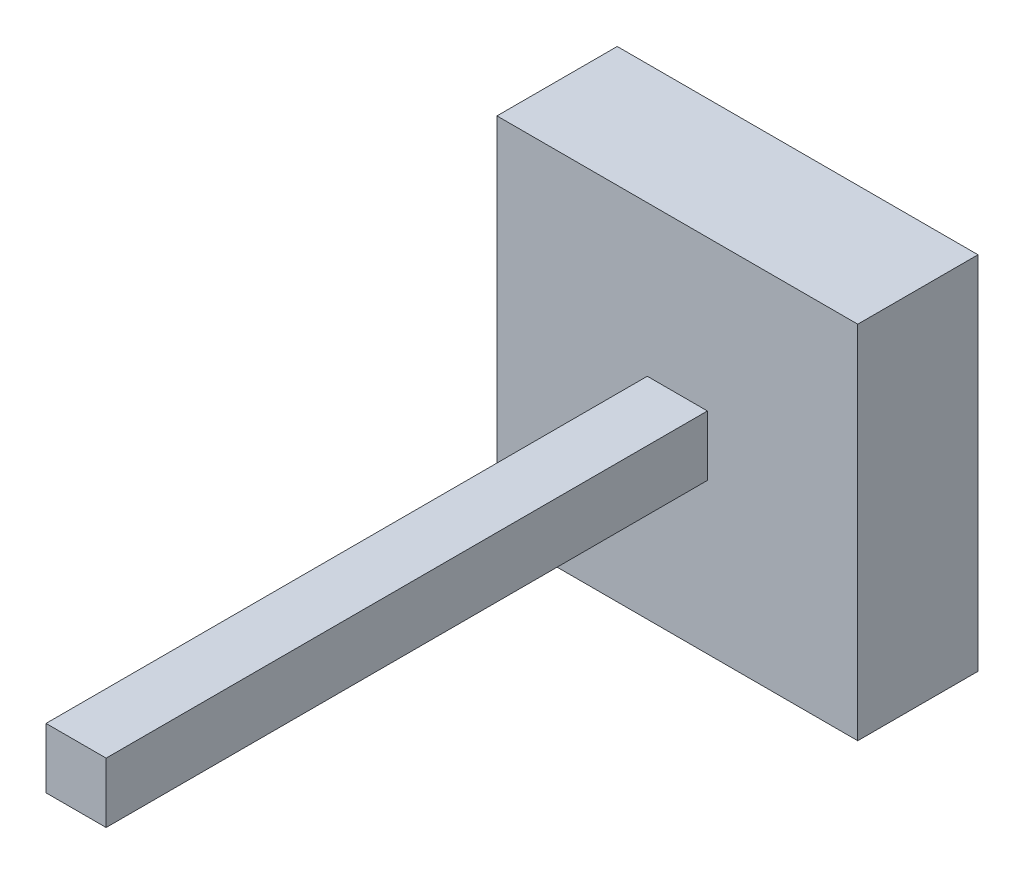
ISO-10303-21;
HEADER;
FILE_DESCRIPTION(('STEP AP214'),'2;1');
FILE_NAME('part.step','',(''),(''),'','','');
FILE_SCHEMA(('AUTOMOTIVE_DESIGN { 1 0 10303 214 1 1 1 1 }'));
ENDSEC;
DATA;
#1=APPLICATION_CONTEXT('core data for automotive mechanical design processes');
#2=APPLICATION_PROTOCOL_DEFINITION('international standard','automotive_design',2000,#1);
#3=PRODUCT_CONTEXT('',#1,'mechanical');
#4=PRODUCT('Part','Part','',(#3));
#5=PRODUCT_RELATED_PRODUCT_CATEGORY('part','',(#4));
#6=PRODUCT_DEFINITION_FORMATION('','',#4);
#7=PRODUCT_DEFINITION_CONTEXT('part definition',#1,'design');
#8=PRODUCT_DEFINITION('design','',#6,#7);
#9=PRODUCT_DEFINITION_SHAPE('','',#8);
#10=(LENGTH_UNIT() NAMED_UNIT(*) SI_UNIT(.MILLI.,.METRE.));
#11=(NAMED_UNIT(*) PLANE_ANGLE_UNIT() SI_UNIT($,.RADIAN.));
#12=(NAMED_UNIT(*) SI_UNIT($,.STERADIAN.) SOLID_ANGLE_UNIT());
#13=UNCERTAINTY_MEASURE_WITH_UNIT(LENGTH_MEASURE(1.E-05),#10,'distance_accuracy_value','');
#14=(GEOMETRIC_REPRESENTATION_CONTEXT(3) GLOBAL_UNCERTAINTY_ASSIGNED_CONTEXT((#13)) GLOBAL_UNIT_ASSIGNED_CONTEXT((#10,
#11,#12)) REPRESENTATION_CONTEXT('',''));
#15=CARTESIAN_POINT('',(0.,0.,0.));
#16=DIRECTION('',(0.,0.,1.));
#17=DIRECTION('',(1.,0.,0.));
#18=AXIS2_PLACEMENT_3D('',#15,#16,#17);
#19=CARTESIAN_POINT('',(0.,0.,100.));
#20=DIRECTION('',(1.,0.,0.));
#21=DIRECTION('',(0.,0.,-1.));
#22=AXIS2_PLACEMENT_3D('',#19,#20,#21);
#23=PLANE('',#22);
#24=DIRECTION('',(0.,-1.,0.));
#25=VECTOR('',#24,1.);
#26=CARTESIAN_POINT('',(0.,0.,0.));
#27=LINE('',#26,#25);
#28=CARTESIAN_POINT('',(0.,10.,0.));
#29=VERTEX_POINT('',#28);
#30=CARTESIAN_POINT('',(0.,0.,0.));
#31=VERTEX_POINT('',#30);
#32=EDGE_CURVE('E128',#29,#31,#27,.T.);
#33=ORIENTED_EDGE('',*,*,#32,.T.);
#34=DIRECTION('',(0.,0.,-1.));
#35=VECTOR('',#34,1.);
#36=CARTESIAN_POINT('',(0.,0.,100.));
#37=LINE('',#36,#35);
#38=CARTESIAN_POINT('',(0.,0.,100.));
#39=VERTEX_POINT('',#38);
#40=EDGE_CURVE('E11',#39,#31,#37,.T.);
#41=ORIENTED_EDGE('',*,*,#40,.F.);
#42=DIRECTION('',(0.,-1.,0.));
#43=VECTOR('',#42,1.);
#44=CARTESIAN_POINT('',(0.,0.,100.));
#45=LINE('',#44,#43);
#46=CARTESIAN_POINT('',(0.,10.,100.));
#47=VERTEX_POINT('',#46);
#48=EDGE_CURVE('E139',#47,#39,#45,.T.);
#49=ORIENTED_EDGE('',*,*,#48,.F.);
#50=DIRECTION('',(0.,0.,-1.));
#51=VECTOR('',#50,1.);
#52=CARTESIAN_POINT('',(0.,10.,100.));
#53=LINE('',#52,#51);
#54=EDGE_CURVE('E150',#47,#29,#53,.T.);
#55=ORIENTED_EDGE('',*,*,#54,.T.);
#56=EDGE_LOOP('',(#33,#41,#49,#55));
#57=FACE_BOUND('',#56,.T.);
#58=ADVANCED_FACE('F39',(#57),#23,.F.);
#59=CARTESIAN_POINT('',(0.,0.,100.));
#60=DIRECTION('',(0.,1.,0.));
#61=DIRECTION('',(0.,0.,1.));
#62=AXIS2_PLACEMENT_3D('',#59,#60,#61);
#63=PLANE('',#62);
#64=DIRECTION('',(1.,0.,0.));
#65=VECTOR('',#64,1.);
#66=CARTESIAN_POINT('',(0.,0.,0.));
#67=LINE('',#66,#65);
#68=CARTESIAN_POINT('',(10.,0.,0.));
#69=VERTEX_POINT('',#68);
#70=EDGE_CURVE('E133',#31,#69,#67,.T.);
#71=ORIENTED_EDGE('',*,*,#70,.T.);
#72=DIRECTION('',(0.,0.,-1.));
#73=VECTOR('',#72,1.);
#74=CARTESIAN_POINT('',(10.,0.,100.));
#75=LINE('',#74,#73);
#76=CARTESIAN_POINT('',(10.,0.,100.));
#77=VERTEX_POINT('',#76);
#78=EDGE_CURVE('E48',#77,#69,#75,.T.);
#79=ORIENTED_EDGE('',*,*,#78,.F.);
#80=DIRECTION('',(1.,0.,0.));
#81=VECTOR('',#80,1.);
#82=CARTESIAN_POINT('',(0.,0.,100.));
#83=LINE('',#82,#81);
#84=EDGE_CURVE('E142',#39,#77,#83,.T.);
#85=ORIENTED_EDGE('',*,*,#84,.F.);
#86=ORIENTED_EDGE('',*,*,#40,.T.);
#87=EDGE_LOOP('',(#71,#79,#85,#86));
#88=FACE_BOUND('',#87,.T.);
#89=ADVANCED_FACE('F177',(#88),#63,.F.);
#90=CARTESIAN_POINT('',(10.,0.,100.));
#91=DIRECTION('',(-1.,0.,0.));
#92=DIRECTION('',(0.,0.,1.));
#93=AXIS2_PLACEMENT_3D('',#90,#91,#92);
#94=PLANE('',#93);
#95=DIRECTION('',(0.,1.,0.));
#96=VECTOR('',#95,1.);
#97=CARTESIAN_POINT('',(10.,0.,0.));
#98=LINE('',#97,#96);
#99=CARTESIAN_POINT('',(10.,10.,0.));
#100=VERTEX_POINT('',#99);
#101=EDGE_CURVE('E155',#69,#100,#98,.T.);
#102=ORIENTED_EDGE('',*,*,#101,.T.);
#103=DIRECTION('',(0.,0.,-1.));
#104=VECTOR('',#103,1.);
#105=CARTESIAN_POINT('',(10.,10.,100.));
#106=LINE('',#105,#104);
#107=CARTESIAN_POINT('',(10.,10.,100.));
#108=VERTEX_POINT('',#107);
#109=EDGE_CURVE('E165',#108,#100,#106,.T.);
#110=ORIENTED_EDGE('',*,*,#109,.F.);
#111=DIRECTION('',(0.,1.,0.));
#112=VECTOR('',#111,1.);
#113=CARTESIAN_POINT('',(10.,0.,100.));
#114=LINE('',#113,#112);
#115=EDGE_CURVE('E146',#77,#108,#114,.T.);
#116=ORIENTED_EDGE('',*,*,#115,.F.);
#117=ORIENTED_EDGE('',*,*,#78,.T.);
#118=EDGE_LOOP('',(#102,#110,#116,#117));
#119=FACE_BOUND('',#118,.T.);
#120=ADVANCED_FACE('F173',(#119),#94,.F.);
#121=CARTESIAN_POINT('',(0.,10.,100.));
#122=DIRECTION('',(0.,-1.,0.));
#123=DIRECTION('',(0.,0.,-1.));
#124=AXIS2_PLACEMENT_3D('',#121,#122,#123);
#125=PLANE('',#124);
#126=DIRECTION('',(-1.,0.,0.));
#127=VECTOR('',#126,1.);
#128=CARTESIAN_POINT('',(0.,10.,0.));
#129=LINE('',#128,#127);
#130=EDGE_CURVE('E143',#100,#29,#129,.T.);
#131=ORIENTED_EDGE('',*,*,#130,.T.);
#132=ORIENTED_EDGE('',*,*,#54,.F.);
#133=DIRECTION('',(-1.,0.,0.));
#134=VECTOR('',#133,1.);
#135=CARTESIAN_POINT('',(0.,10.,100.));
#136=LINE('',#135,#134);
#137=EDGE_CURVE('E55',#108,#47,#136,.T.);
#138=ORIENTED_EDGE('',*,*,#137,.F.);
#139=ORIENTED_EDGE('',*,*,#109,.T.);
#140=EDGE_LOOP('',(#131,#132,#138,#139));
#141=FACE_BOUND('',#140,.T.);
#142=ADVANCED_FACE('F182',(#141),#125,.F.);
#143=CARTESIAN_POINT('',(0.,0.,100.));
#144=DIRECTION('',(0.,0.,-1.));
#145=DIRECTION('',(-1.,0.,0.));
#146=AXIS2_PLACEMENT_3D('',#143,#144,#145);
#147=PLANE('',#146);
#148=ORIENTED_EDGE('',*,*,#48,.T.);
#149=ORIENTED_EDGE('',*,*,#84,.T.);
#150=ORIENTED_EDGE('',*,*,#115,.T.);
#151=ORIENTED_EDGE('',*,*,#137,.T.);
#152=EDGE_LOOP('',(#148,#149,#150,#151));
#153=FACE_BOUND('',#152,.T.);
#154=ADVANCED_FACE('F185',(#153),#147,.F.);
#155=CARTESIAN_POINT('',(0.,0.,0.));
#156=DIRECTION('',(0.,0.,1.));
#157=DIRECTION('',(1.,0.,0.));
#158=AXIS2_PLACEMENT_3D('',#155,#156,#157);
#159=PLANE('',#158);
#160=DIRECTION('',(0.,1.,0.));
#161=VECTOR('',#160,1.);
#162=CARTESIAN_POINT('',(-25.,-25.,0.));
#163=LINE('',#162,#161);
#164=CARTESIAN_POINT('',(-25.,-25.,0.));
#165=VERTEX_POINT('',#164);
#166=CARTESIAN_POINT('',(-25.,35.,0.));
#167=VERTEX_POINT('',#166);
#168=EDGE_CURVE('E126',#165,#167,#163,.T.);
#169=ORIENTED_EDGE('',*,*,#168,.F.);
#170=DIRECTION('',(-1.,0.,0.));
#171=VECTOR('',#170,1.);
#172=CARTESIAN_POINT('',(35.,-25.,0.));
#173=LINE('',#172,#171);
#174=CARTESIAN_POINT('',(35.,-25.,0.));
#175=VERTEX_POINT('',#174);
#176=EDGE_CURVE('E122',#175,#165,#173,.T.);
#177=ORIENTED_EDGE('',*,*,#176,.F.);
#178=DIRECTION('',(0.,-1.,0.));
#179=VECTOR('',#178,1.);
#180=CARTESIAN_POINT('',(35.,-25.,0.));
#181=LINE('',#180,#179);
#182=CARTESIAN_POINT('',(35.,35.,0.));
#183=VERTEX_POINT('',#182);
#184=EDGE_CURVE('E270',#183,#175,#181,.T.);
#185=ORIENTED_EDGE('',*,*,#184,.F.);
#186=DIRECTION('',(1.,0.,0.));
#187=VECTOR('',#186,1.);
#188=CARTESIAN_POINT('',(35.,35.,0.));
#189=LINE('',#188,#187);
#190=EDGE_CURVE('E274',#167,#183,#189,.T.);
#191=ORIENTED_EDGE('',*,*,#190,.F.);
#192=EDGE_LOOP('',(#169,#177,#185,#191));
#193=FACE_BOUND('',#192,.T.);
#194=ORIENTED_EDGE('',*,*,#32,.F.);
#195=ORIENTED_EDGE('',*,*,#130,.F.);
#196=ORIENTED_EDGE('',*,*,#101,.F.);
#197=ORIENTED_EDGE('',*,*,#70,.F.);
#198=EDGE_LOOP('',(#194,#195,#196,#197));
#199=FACE_BOUND('',#198,.T.);
#200=ADVANCED_FACE('F180',(#193,#199),#159,.T.);
#201=CARTESIAN_POINT('',(-25.,-25.,-20.));
#202=DIRECTION('',(1.,0.,0.));
#203=DIRECTION('',(0.,0.,-1.));
#204=AXIS2_PLACEMENT_3D('',#201,#202,#203);
#205=PLANE('',#204);
#206=ORIENTED_EDGE('',*,*,#168,.T.);
#207=DIRECTION('',(0.,0.,1.));
#208=VECTOR('',#207,1.);
#209=CARTESIAN_POINT('',(-25.,35.,-20.));
#210=LINE('',#209,#208);
#211=CARTESIAN_POINT('',(-25.,35.,-20.));
#212=VERTEX_POINT('',#211);
#213=EDGE_CURVE('E104',#212,#167,#210,.T.);
#214=ORIENTED_EDGE('',*,*,#213,.F.);
#215=DIRECTION('',(0.,1.,0.));
#216=VECTOR('',#215,1.);
#217=CARTESIAN_POINT('',(-25.,-25.,-20.));
#218=LINE('',#217,#216);
#219=CARTESIAN_POINT('',(-25.,-25.,-20.));
#220=VERTEX_POINT('',#219);
#221=EDGE_CURVE('E112',#220,#212,#218,.T.);
#222=ORIENTED_EDGE('',*,*,#221,.F.);
#223=DIRECTION('',(0.,0.,1.));
#224=VECTOR('',#223,1.);
#225=CARTESIAN_POINT('',(-25.,-25.,-20.));
#226=LINE('',#225,#224);
#227=EDGE_CURVE('E266',#220,#165,#226,.T.);
#228=ORIENTED_EDGE('',*,*,#227,.T.);
#229=EDGE_LOOP('',(#206,#214,#222,#228));
#230=FACE_BOUND('',#229,.T.);
#231=ADVANCED_FACE('F124',(#230),#205,.F.);
#232=CARTESIAN_POINT('',(35.,35.,-20.));
#233=DIRECTION('',(0.,-1.,0.));
#234=DIRECTION('',(0.,0.,-1.));
#235=AXIS2_PLACEMENT_3D('',#232,#233,#234);
#236=PLANE('',#235);
#237=ORIENTED_EDGE('',*,*,#190,.T.);
#238=DIRECTION('',(0.,0.,1.));
#239=VECTOR('',#238,1.);
#240=CARTESIAN_POINT('',(35.,35.,-20.));
#241=LINE('',#240,#239);
#242=CARTESIAN_POINT('',(35.,35.,-20.));
#243=VERTEX_POINT('',#242);
#244=EDGE_CURVE('E107',#243,#183,#241,.T.);
#245=ORIENTED_EDGE('',*,*,#244,.F.);
#246=DIRECTION('',(1.,0.,0.));
#247=VECTOR('',#246,1.);
#248=CARTESIAN_POINT('',(35.,35.,-20.));
#249=LINE('',#248,#247);
#250=EDGE_CURVE('E100',#212,#243,#249,.T.);
#251=ORIENTED_EDGE('',*,*,#250,.F.);
#252=ORIENTED_EDGE('',*,*,#213,.T.);
#253=EDGE_LOOP('',(#237,#245,#251,#252));
#254=FACE_BOUND('',#253,.T.);
#255=ADVANCED_FACE('F102',(#254),#236,.F.);
#256=CARTESIAN_POINT('',(35.,-25.,-20.));
#257=DIRECTION('',(-1.,0.,0.));
#258=DIRECTION('',(0.,0.,1.));
#259=AXIS2_PLACEMENT_3D('',#256,#257,#258);
#260=PLANE('',#259);
#261=ORIENTED_EDGE('',*,*,#184,.T.);
#262=DIRECTION('',(0.,0.,1.));
#263=VECTOR('',#262,1.);
#264=CARTESIAN_POINT('',(35.,-25.,-20.));
#265=LINE('',#264,#263);
#266=CARTESIAN_POINT('',(35.,-25.,-20.));
#267=VERTEX_POINT('',#266);
#268=EDGE_CURVE('E135',#267,#175,#265,.T.);
#269=ORIENTED_EDGE('',*,*,#268,.F.);
#270=DIRECTION('',(0.,-1.,0.));
#271=VECTOR('',#270,1.);
#272=CARTESIAN_POINT('',(35.,-25.,-20.));
#273=LINE('',#272,#271);
#274=EDGE_CURVE('E111',#243,#267,#273,.T.);
#275=ORIENTED_EDGE('',*,*,#274,.F.);
#276=ORIENTED_EDGE('',*,*,#244,.T.);
#277=EDGE_LOOP('',(#261,#269,#275,#276));
#278=FACE_BOUND('',#277,.T.);
#279=ADVANCED_FACE('F233',(#278),#260,.F.);
#280=CARTESIAN_POINT('',(35.,-25.,-20.));
#281=DIRECTION('',(0.,1.,0.));
#282=DIRECTION('',(0.,0.,1.));
#283=AXIS2_PLACEMENT_3D('',#280,#281,#282);
#284=PLANE('',#283);
#285=ORIENTED_EDGE('',*,*,#176,.T.);
#286=ORIENTED_EDGE('',*,*,#227,.F.);
#287=DIRECTION('',(-1.,0.,0.));
#288=VECTOR('',#287,1.);
#289=CARTESIAN_POINT('',(35.,-25.,-20.));
#290=LINE('',#289,#288);
#291=EDGE_CURVE('E117',#267,#220,#290,.T.);
#292=ORIENTED_EDGE('',*,*,#291,.F.);
#293=ORIENTED_EDGE('',*,*,#268,.T.);
#294=EDGE_LOOP('',(#285,#286,#292,#293));
#295=FACE_BOUND('',#294,.T.);
#296=ADVANCED_FACE('F242',(#295),#284,.F.);
#297=CARTESIAN_POINT('',(0.,0.,-20.));
#298=DIRECTION('',(0.,0.,1.));
#299=DIRECTION('',(1.,0.,0.));
#300=AXIS2_PLACEMENT_3D('',#297,#298,#299);
#301=PLANE('',#300);
#302=ORIENTED_EDGE('',*,*,#221,.T.);
#303=ORIENTED_EDGE('',*,*,#250,.T.);
#304=ORIENTED_EDGE('',*,*,#274,.T.);
#305=ORIENTED_EDGE('',*,*,#291,.T.);
#306=EDGE_LOOP('',(#302,#303,#304,#305));
#307=FACE_BOUND('',#306,.T.);
#308=ADVANCED_FACE('F115',(#307),#301,.F.);
#309=CLOSED_SHELL('',(#58,#89,#120,#142,#154,#200,#231,#255,#279,#296,#308));
#310=MANIFOLD_SOLID_BREP('B2',#309);
#311=ADVANCED_BREP_SHAPE_REPRESENTATION('',(#18,#310),#14);
#312=SHAPE_DEFINITION_REPRESENTATION(#9,#311);
ENDSEC;
END-ISO-10303-21;
